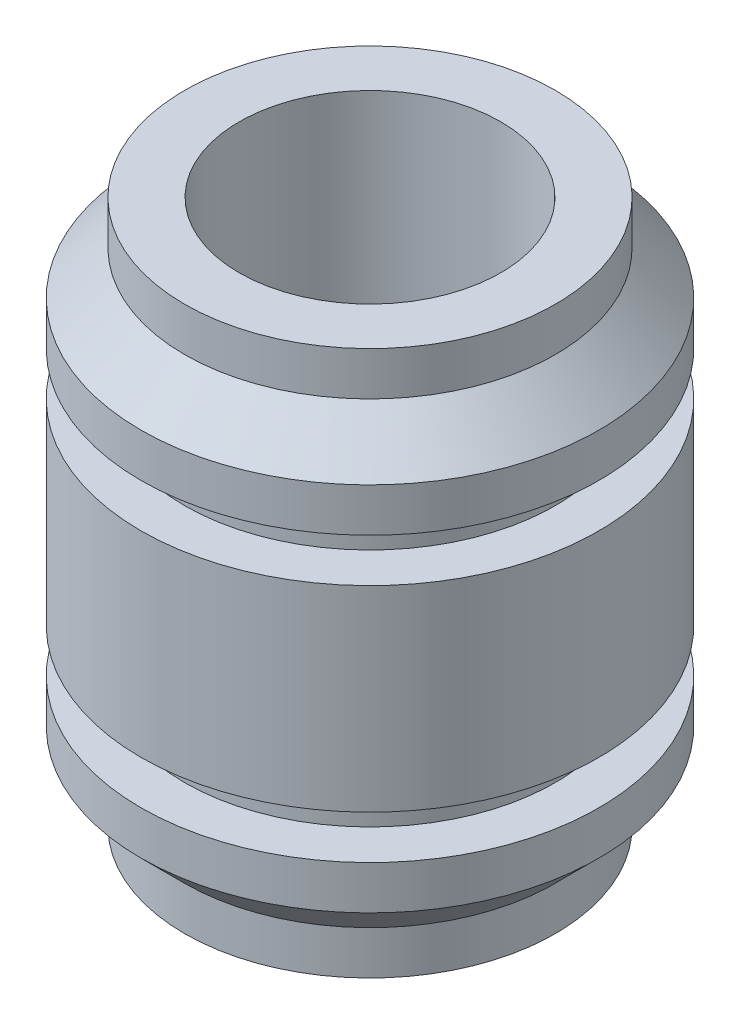
ISO-10303-21;
HEADER;
FILE_DESCRIPTION(('STEP AP214'),'2;1');
FILE_NAME('part.step','',(''),(''),'','','');
FILE_SCHEMA(('AUTOMOTIVE_DESIGN { 1 0 10303 214 1 1 1 1 }'));
ENDSEC;
DATA;
#1=APPLICATION_CONTEXT('core data for automotive mechanical design processes');
#2=APPLICATION_PROTOCOL_DEFINITION('international standard','automotive_design',2000,#1);
#3=PRODUCT_CONTEXT('',#1,'mechanical');
#4=PRODUCT('Part','Part','',(#3));
#5=PRODUCT_RELATED_PRODUCT_CATEGORY('part','',(#4));
#6=PRODUCT_DEFINITION_FORMATION('','',#4);
#7=PRODUCT_DEFINITION_CONTEXT('part definition',#1,'design');
#8=PRODUCT_DEFINITION('design','',#6,#7);
#9=PRODUCT_DEFINITION_SHAPE('','',#8);
#10=(LENGTH_UNIT() NAMED_UNIT(*) SI_UNIT(.MILLI.,.METRE.));
#11=(NAMED_UNIT(*) PLANE_ANGLE_UNIT() SI_UNIT($,.RADIAN.));
#12=(NAMED_UNIT(*) SI_UNIT($,.STERADIAN.) SOLID_ANGLE_UNIT());
#13=UNCERTAINTY_MEASURE_WITH_UNIT(LENGTH_MEASURE(1.E-05),#10,'distance_accuracy_value','');
#14=(GEOMETRIC_REPRESENTATION_CONTEXT(3) GLOBAL_UNCERTAINTY_ASSIGNED_CONTEXT((#13)) GLOBAL_UNIT_ASSIGNED_CONTEXT((#10,
#11,#12)) REPRESENTATION_CONTEXT('',''));
#15=CARTESIAN_POINT('',(0.,0.,0.));
#16=DIRECTION('',(0.,0.,1.));
#17=DIRECTION('',(1.,0.,0.));
#18=AXIS2_PLACEMENT_3D('',#15,#16,#17);
#19=CARTESIAN_POINT('',(0.,2.5,0.));
#20=DIRECTION('',(0.,-1.,0.));
#21=DIRECTION('',(0.,0.,-1.));
#22=AXIS2_PLACEMENT_3D('',#19,#20,#21);
#23=CYLINDRICAL_SURFACE('',#22,1.05);
#24=CARTESIAN_POINT('',(0.,0.600000000000007,0.));
#25=DIRECTION('',(0.,-1.,0.));
#26=DIRECTION('',(0.,0.,-1.));
#27=AXIS2_PLACEMENT_3D('',#24,#25,#26);
#28=CIRCLE('',#27,1.05);
#29=CARTESIAN_POINT('',(0.,0.600000000000007,-1.05));
#30=VERTEX_POINT('',#29);
#31=EDGE_CURVE('E60',#30,#30,#28,.T.);
#32=ORIENTED_EDGE('',*,*,#31,.T.);
#33=EDGE_LOOP('',(#32));
#34=FACE_BOUND('',#33,.T.);
#35=CARTESIAN_POINT('',(0.,0.400000000000007,0.));
#36=DIRECTION('',(0.,-1.,0.));
#37=DIRECTION('',(0.,0.,-1.));
#38=AXIS2_PLACEMENT_3D('',#35,#36,#37);
#39=CIRCLE('',#38,1.05);
#40=CARTESIAN_POINT('',(0.,0.400000000000007,-1.05));
#41=VERTEX_POINT('',#40);
#42=EDGE_CURVE('E84',#41,#41,#39,.T.);
#43=ORIENTED_EDGE('',*,*,#42,.F.);
#44=EDGE_LOOP('',(#43));
#45=FACE_BOUND('',#44,.T.);
#46=ADVANCED_FACE('F33',(#34,#45),#23,.T.);
#47=CARTESIAN_POINT('',(0.,0.,0.));
#48=DIRECTION('',(0.,1.,0.));
#49=DIRECTION('',(0.,0.,1.));
#50=AXIS2_PLACEMENT_3D('',#47,#48,#49);
#51=PLANE('',#50);
#52=CARTESIAN_POINT('',(0.,0.,0.));
#53=DIRECTION('',(0.,1.,0.));
#54=DIRECTION('',(0.,0.,1.));
#55=AXIS2_PLACEMENT_3D('',#52,#53,#54);
#56=CIRCLE('',#55,0.6);
#57=CARTESIAN_POINT('',(0.,0.,0.6));
#58=VERTEX_POINT('',#57);
#59=EDGE_CURVE('E37',#58,#58,#56,.T.);
#60=ORIENTED_EDGE('',*,*,#59,.T.);
#61=EDGE_LOOP('',(#60));
#62=FACE_BOUND('',#61,.T.);
#63=CARTESIAN_POINT('',(0.,0.,0.));
#64=DIRECTION('',(0.,-1.,0.));
#65=DIRECTION('',(0.,0.,-1.));
#66=AXIS2_PLACEMENT_3D('',#63,#64,#65);
#67=CIRCLE('',#66,0.849999999999993);
#68=CARTESIAN_POINT('',(0.,0.,-0.849999999999993));
#69=VERTEX_POINT('',#68);
#70=EDGE_CURVE('E78',#69,#69,#67,.T.);
#71=ORIENTED_EDGE('',*,*,#70,.T.);
#72=EDGE_LOOP('',(#71));
#73=FACE_BOUND('',#72,.T.);
#74=ADVANCED_FACE('F92',(#62,#73),#51,.F.);
#75=CARTESIAN_POINT('',(0.,1.89999999999999,0.));
#76=DIRECTION('',(0.,-1.,0.));
#77=DIRECTION('',(0.,0.,-1.));
#78=AXIS2_PLACEMENT_3D('',#75,#76,#77);
#79=CIRCLE('',#78,1.05);
#80=CARTESIAN_POINT('',(0.,1.89999999999999,-1.05));
#81=VERTEX_POINT('',#80);
#82=EDGE_CURVE('E51',#81,#81,#79,.T.);
#83=ORIENTED_EDGE('',*,*,#82,.F.);
#84=EDGE_LOOP('',(#83));
#85=FACE_BOUND('',#84,.T.);
#86=CARTESIAN_POINT('',(0.,2.09999999999999,0.));
#87=DIRECTION('',(0.,-1.,0.));
#88=DIRECTION('',(0.,0.,-1.));
#89=AXIS2_PLACEMENT_3D('',#86,#87,#88);
#90=CIRCLE('',#89,1.05);
#91=CARTESIAN_POINT('',(0.,2.09999999999999,-1.05));
#92=VERTEX_POINT('',#91);
#93=EDGE_CURVE('E75',#92,#92,#90,.T.);
#94=ORIENTED_EDGE('',*,*,#93,.T.);
#95=EDGE_LOOP('',(#94));
#96=FACE_BOUND('',#95,.T.);
#97=ADVANCED_FACE('F94',(#85,#96),#23,.T.);
#98=CARTESIAN_POINT('',(0.,2.5,0.));
#99=DIRECTION('',(0.,1.,0.));
#100=DIRECTION('',(0.,0.,1.));
#101=AXIS2_PLACEMENT_3D('',#98,#99,#100);
#102=PLANE('',#101);
#103=CARTESIAN_POINT('',(0.,2.5,0.));
#104=DIRECTION('',(0.,1.,0.));
#105=DIRECTION('',(0.,0.,1.));
#106=AXIS2_PLACEMENT_3D('',#103,#104,#105);
#107=CIRCLE('',#106,0.6);
#108=CARTESIAN_POINT('',(0.,2.5,0.6));
#109=VERTEX_POINT('',#108);
#110=EDGE_CURVE('E10',#109,#109,#107,.T.);
#111=ORIENTED_EDGE('',*,*,#110,.F.);
#112=EDGE_LOOP('',(#111));
#113=FACE_BOUND('',#112,.T.);
#114=CARTESIAN_POINT('',(0.,2.5,0.));
#115=DIRECTION('',(0.,-1.,0.));
#116=DIRECTION('',(0.,0.,-1.));
#117=AXIS2_PLACEMENT_3D('',#114,#115,#116);
#118=CIRCLE('',#117,0.849999999999993);
#119=CARTESIAN_POINT('',(0.,2.5,-0.849999999999993));
#120=VERTEX_POINT('',#119);
#121=EDGE_CURVE('E69',#120,#120,#118,.T.);
#122=ORIENTED_EDGE('',*,*,#121,.F.);
#123=EDGE_LOOP('',(#122));
#124=FACE_BOUND('',#123,.T.);
#125=ADVANCED_FACE('F102',(#113,#124),#102,.T.);
#126=CARTESIAN_POINT('',(0.,1.69999999999999,0.));
#127=DIRECTION('',(0.,-1.,0.));
#128=DIRECTION('',(0.,0.,-1.));
#129=AXIS2_PLACEMENT_3D('',#126,#127,#128);
#130=CIRCLE('',#129,1.05);
#131=CARTESIAN_POINT('',(0.,1.69999999999999,-1.05));
#132=VERTEX_POINT('',#131);
#133=EDGE_CURVE('E54',#132,#132,#130,.T.);
#134=ORIENTED_EDGE('',*,*,#133,.T.);
#135=EDGE_LOOP('',(#134));
#136=FACE_BOUND('',#135,.T.);
#137=CARTESIAN_POINT('',(0.,0.800000000000007,0.));
#138=DIRECTION('',(0.,-1.,0.));
#139=DIRECTION('',(0.,0.,-1.));
#140=AXIS2_PLACEMENT_3D('',#137,#138,#139);
#141=CIRCLE('',#140,1.05);
#142=CARTESIAN_POINT('',(0.,0.800000000000007,-1.05));
#143=VERTEX_POINT('',#142);
#144=EDGE_CURVE('E63',#143,#143,#141,.T.);
#145=ORIENTED_EDGE('',*,*,#144,.F.);
#146=EDGE_LOOP('',(#145));
#147=FACE_BOUND('',#146,.T.);
#148=ADVANCED_FACE('F95',(#136,#147),#23,.T.);
#149=CARTESIAN_POINT('',(0.,2.5,0.));
#150=DIRECTION('',(0.,-1.,0.));
#151=DIRECTION('',(0.,0.,-1.));
#152=AXIS2_PLACEMENT_3D('',#149,#150,#151);
#153=CYLINDRICAL_SURFACE('',#152,0.6);
#154=ORIENTED_EDGE('',*,*,#110,.T.);
#155=EDGE_LOOP('',(#154));
#156=FACE_BOUND('',#155,.T.);
#157=ORIENTED_EDGE('',*,*,#59,.F.);
#158=EDGE_LOOP('',(#157));
#159=FACE_BOUND('',#158,.T.);
#160=ADVANCED_FACE('F35',(#156,#159),#153,.F.);
#161=CARTESIAN_POINT('',(0.,1.69999999999999,1.05));
#162=DIRECTION('',(0.,1.,0.));
#163=DIRECTION('',(0.,0.,1.));
#164=AXIS2_PLACEMENT_3D('',#161,#162,#163);
#165=PLANE('',#164);
#166=CARTESIAN_POINT('',(0.,1.69999999999999,0.));
#167=DIRECTION('',(0.,-1.,0.));
#168=DIRECTION('',(0.,0.,-1.));
#169=AXIS2_PLACEMENT_3D('',#166,#167,#168);
#170=CIRCLE('',#169,0.849999999999993);
#171=CARTESIAN_POINT('',(0.,1.69999999999999,-0.849999999999993));
#172=VERTEX_POINT('',#171);
#173=EDGE_CURVE('E44',#172,#172,#170,.T.);
#174=ORIENTED_EDGE('',*,*,#173,.T.);
#175=EDGE_LOOP('',(#174));
#176=FACE_BOUND('',#175,.T.);
#177=ORIENTED_EDGE('',*,*,#133,.F.);
#178=EDGE_LOOP('',(#177));
#179=FACE_BOUND('',#178,.T.);
#180=ADVANCED_FACE('F110',(#176,#179),#165,.T.);
#181=CARTESIAN_POINT('',(0.,0.,0.));
#182=DIRECTION('',(0.,-1.,0.));
#183=DIRECTION('',(0.,0.,-1.));
#184=AXIS2_PLACEMENT_3D('',#181,#182,#183);
#185=CYLINDRICAL_SURFACE('',#184,0.849999999999993);
#186=CARTESIAN_POINT('',(0.,1.89999999999999,0.));
#187=DIRECTION('',(0.,-1.,0.));
#188=DIRECTION('',(0.,0.,-1.));
#189=AXIS2_PLACEMENT_3D('',#186,#187,#188);
#190=CIRCLE('',#189,0.849999999999993);
#191=CARTESIAN_POINT('',(0.,1.89999999999999,-0.849999999999993));
#192=VERTEX_POINT('',#191);
#193=EDGE_CURVE('E48',#192,#192,#190,.T.);
#194=ORIENTED_EDGE('',*,*,#193,.T.);
#195=EDGE_LOOP('',(#194));
#196=FACE_BOUND('',#195,.T.);
#197=ORIENTED_EDGE('',*,*,#173,.F.);
#198=EDGE_LOOP('',(#197));
#199=FACE_BOUND('',#198,.T.);
#200=ADVANCED_FACE('F142',(#196,#199),#185,.T.);
#201=CARTESIAN_POINT('',(0.,1.89999999999999,0.849999999999993));
#202=DIRECTION('',(0.,-1.,0.));
#203=DIRECTION('',(0.,0.,-1.));
#204=AXIS2_PLACEMENT_3D('',#201,#202,#203);
#205=PLANE('',#204);
#206=ORIENTED_EDGE('',*,*,#82,.T.);
#207=EDGE_LOOP('',(#206));
#208=FACE_BOUND('',#207,.T.);
#209=ORIENTED_EDGE('',*,*,#193,.F.);
#210=EDGE_LOOP('',(#209));
#211=FACE_BOUND('',#210,.T.);
#212=ADVANCED_FACE('F128',(#208,#211),#205,.T.);
#213=CARTESIAN_POINT('',(0.,0.,0.));
#214=DIRECTION('',(0.,-1.,0.));
#215=DIRECTION('',(0.,0.,-1.));
#216=AXIS2_PLACEMENT_3D('',#213,#214,#215);
#217=CYLINDRICAL_SURFACE('',#216,0.849999999999993);
#218=CARTESIAN_POINT('',(0.,0.800000000000007,0.));
#219=DIRECTION('',(0.,-1.,0.));
#220=DIRECTION('',(0.,0.,-1.));
#221=AXIS2_PLACEMENT_3D('',#218,#219,#220);
#222=CIRCLE('',#221,0.849999999999993);
#223=CARTESIAN_POINT('',(0.,0.800000000000007,-0.849999999999993));
#224=VERTEX_POINT('',#223);
#225=EDGE_CURVE('E66',#224,#224,#222,.T.);
#226=ORIENTED_EDGE('',*,*,#225,.T.);
#227=EDGE_LOOP('',(#226));
#228=FACE_BOUND('',#227,.T.);
#229=CARTESIAN_POINT('',(0.,0.600000000000007,0.));
#230=DIRECTION('',(0.,-1.,0.));
#231=DIRECTION('',(0.,0.,-1.));
#232=AXIS2_PLACEMENT_3D('',#229,#230,#231);
#233=CIRCLE('',#232,0.849999999999993);
#234=CARTESIAN_POINT('',(0.,0.600000000000007,-0.849999999999993));
#235=VERTEX_POINT('',#234);
#236=EDGE_CURVE('E57',#235,#235,#233,.T.);
#237=ORIENTED_EDGE('',*,*,#236,.F.);
#238=EDGE_LOOP('',(#237));
#239=FACE_BOUND('',#238,.T.);
#240=ADVANCED_FACE('F125',(#228,#239),#217,.T.);
#241=CARTESIAN_POINT('',(0.,0.600000000000007,0.849999999999993));
#242=DIRECTION('',(0.,1.,0.));
#243=DIRECTION('',(0.,0.,1.));
#244=AXIS2_PLACEMENT_3D('',#241,#242,#243);
#245=PLANE('',#244);
#246=ORIENTED_EDGE('',*,*,#236,.T.);
#247=EDGE_LOOP('',(#246));
#248=FACE_BOUND('',#247,.T.);
#249=ORIENTED_EDGE('',*,*,#31,.F.);
#250=EDGE_LOOP('',(#249));
#251=FACE_BOUND('',#250,.T.);
#252=ADVANCED_FACE('F121',(#248,#251),#245,.T.);
#253=CARTESIAN_POINT('',(0.,0.800000000000007,1.05));
#254=DIRECTION('',(0.,-1.,0.));
#255=DIRECTION('',(0.,0.,-1.));
#256=AXIS2_PLACEMENT_3D('',#253,#254,#255);
#257=PLANE('',#256);
#258=ORIENTED_EDGE('',*,*,#144,.T.);
#259=EDGE_LOOP('',(#258));
#260=FACE_BOUND('',#259,.T.);
#261=ORIENTED_EDGE('',*,*,#225,.F.);
#262=EDGE_LOOP('',(#261));
#263=FACE_BOUND('',#262,.T.);
#264=ADVANCED_FACE('F117',(#260,#263),#257,.T.);
#265=CARTESIAN_POINT('',(0.,0.,0.));
#266=DIRECTION('',(0.,-1.,0.));
#267=DIRECTION('',(0.,0.,-1.));
#268=AXIS2_PLACEMENT_3D('',#265,#266,#267);
#269=CYLINDRICAL_SURFACE('',#268,0.849999999999993);
#270=ORIENTED_EDGE('',*,*,#121,.T.);
#271=EDGE_LOOP('',(#270));
#272=FACE_BOUND('',#271,.T.);
#273=CARTESIAN_POINT('',(0.,2.3,0.));
#274=DIRECTION('',(0.,-1.,0.));
#275=DIRECTION('',(0.,0.,-1.));
#276=AXIS2_PLACEMENT_3D('',#273,#274,#275);
#277=CIRCLE('',#276,0.849999999999993);
#278=CARTESIAN_POINT('',(0.,2.3,-0.849999999999993));
#279=VERTEX_POINT('',#278);
#280=EDGE_CURVE('E72',#279,#279,#277,.T.);
#281=ORIENTED_EDGE('',*,*,#280,.F.);
#282=EDGE_LOOP('',(#281));
#283=FACE_BOUND('',#282,.T.);
#284=ADVANCED_FACE('F120',(#272,#283),#269,.T.);
#285=CARTESIAN_POINT('',(0.,2.09999999999999,0.));
#286=DIRECTION('',(0.,-1.,0.));
#287=DIRECTION('',(0.,0.,-1.));
#288=AXIS2_PLACEMENT_3D('',#285,#286,#287);
#289=CONICAL_SURFACE('',#288,1.05,0.78539816339745);
#290=ORIENTED_EDGE('',*,*,#280,.T.);
#291=EDGE_LOOP('',(#290));
#292=FACE_BOUND('',#291,.T.);
#293=ORIENTED_EDGE('',*,*,#93,.F.);
#294=EDGE_LOOP('',(#293));
#295=FACE_BOUND('',#294,.T.);
#296=ADVANCED_FACE('F187',(#292,#295),#289,.T.);
#297=CARTESIAN_POINT('',(0.,0.,0.));
#298=DIRECTION('',(0.,-1.,0.));
#299=DIRECTION('',(0.,0.,-1.));
#300=AXIS2_PLACEMENT_3D('',#297,#298,#299);
#301=CYLINDRICAL_SURFACE('',#300,0.849999999999993);
#302=CARTESIAN_POINT('',(0.,0.2,0.));
#303=DIRECTION('',(0.,-1.,0.));
#304=DIRECTION('',(0.,0.,-1.));
#305=AXIS2_PLACEMENT_3D('',#302,#303,#304);
#306=CIRCLE('',#305,0.849999999999993);
#307=CARTESIAN_POINT('',(0.,0.2,-0.849999999999993));
#308=VERTEX_POINT('',#307);
#309=EDGE_CURVE('E81',#308,#308,#306,.T.);
#310=ORIENTED_EDGE('',*,*,#309,.T.);
#311=EDGE_LOOP('',(#310));
#312=FACE_BOUND('',#311,.T.);
#313=ORIENTED_EDGE('',*,*,#70,.F.);
#314=EDGE_LOOP('',(#313));
#315=FACE_BOUND('',#314,.T.);
#316=ADVANCED_FACE('F196',(#312,#315),#301,.T.);
#317=CARTESIAN_POINT('',(0.,0.2,0.));
#318=DIRECTION('',(0.,1.,0.));
#319=DIRECTION('',(0.,0.,1.));
#320=AXIS2_PLACEMENT_3D('',#317,#318,#319);
#321=CONICAL_SURFACE('',#320,0.849999999999993,0.78539816339745);
#322=ORIENTED_EDGE('',*,*,#42,.T.);
#323=EDGE_LOOP('',(#322));
#324=FACE_BOUND('',#323,.T.);
#325=ORIENTED_EDGE('',*,*,#309,.F.);
#326=EDGE_LOOP('',(#325));
#327=FACE_BOUND('',#326,.T.);
#328=ADVANCED_FACE('F88',(#324,#327),#321,.T.);
#329=CLOSED_SHELL('',(#46,#74,#97,#125,#148,#160,#180,#200,#212,#240,#252,#264,#284,#296,#316,#328));
#330=MANIFOLD_SOLID_BREP('B2',#329);
#331=ADVANCED_BREP_SHAPE_REPRESENTATION('',(#18,#330),#14);
#332=SHAPE_DEFINITION_REPRESENTATION(#9,#331);
ENDSEC;
END-ISO-10303-21;
